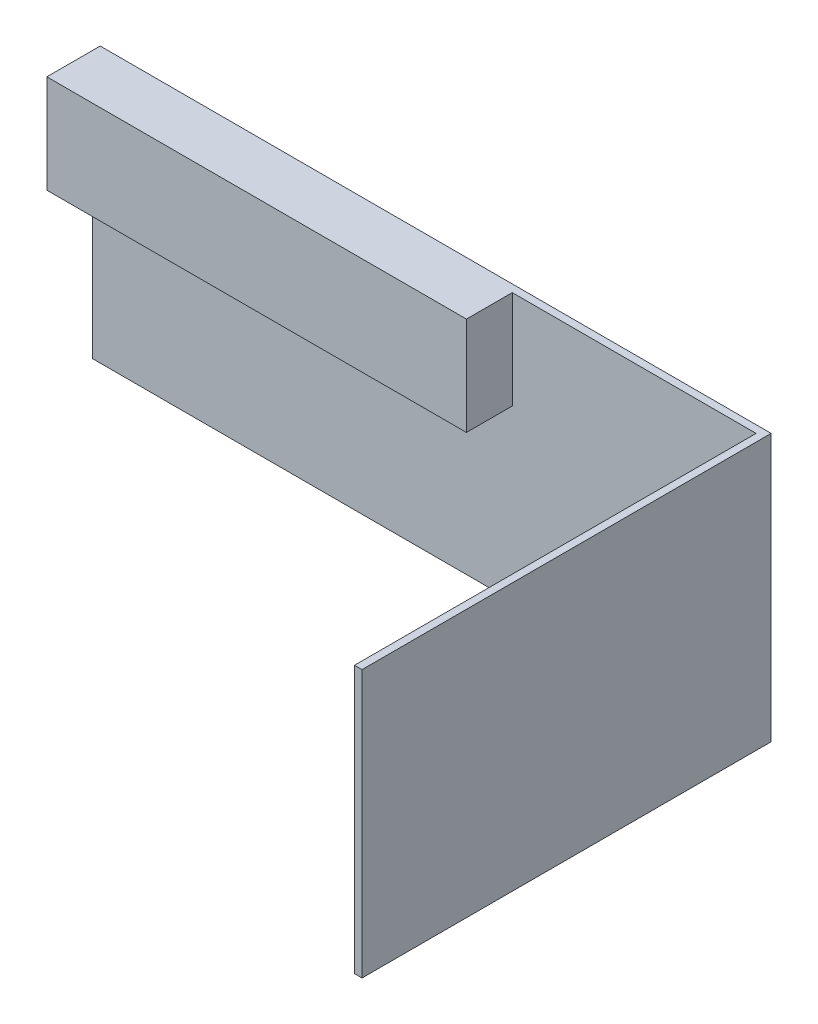
ISO-10303-21;
HEADER;
FILE_DESCRIPTION(('STEP AP214'),'2;1');
FILE_NAME('part.step','',(''),(''),'','','');
FILE_SCHEMA(('AUTOMOTIVE_DESIGN { 1 0 10303 214 1 1 1 1 }'));
ENDSEC;
DATA;
#1=APPLICATION_CONTEXT('core data for automotive mechanical design processes');
#2=APPLICATION_PROTOCOL_DEFINITION('international standard','automotive_design',2000,#1);
#3=PRODUCT_CONTEXT('',#1,'mechanical');
#4=PRODUCT('Part','Part','',(#3));
#5=PRODUCT_RELATED_PRODUCT_CATEGORY('part','',(#4));
#6=PRODUCT_DEFINITION_FORMATION('','',#4);
#7=PRODUCT_DEFINITION_CONTEXT('part definition',#1,'design');
#8=PRODUCT_DEFINITION('design','',#6,#7);
#9=PRODUCT_DEFINITION_SHAPE('','',#8);
#10=(LENGTH_UNIT() NAMED_UNIT(*) SI_UNIT(.MILLI.,.METRE.));
#11=(NAMED_UNIT(*) PLANE_ANGLE_UNIT() SI_UNIT($,.RADIAN.));
#12=(NAMED_UNIT(*) SI_UNIT($,.STERADIAN.) SOLID_ANGLE_UNIT());
#13=UNCERTAINTY_MEASURE_WITH_UNIT(LENGTH_MEASURE(1.E-05),#10,'distance_accuracy_value','');
#14=(GEOMETRIC_REPRESENTATION_CONTEXT(3) GLOBAL_UNCERTAINTY_ASSIGNED_CONTEXT((#13)) GLOBAL_UNIT_ASSIGNED_CONTEXT((#10,
#11,#12)) REPRESENTATION_CONTEXT('',''));
#15=CARTESIAN_POINT('',(0.,0.,0.));
#16=DIRECTION('',(0.,0.,1.));
#17=DIRECTION('',(1.,0.,0.));
#18=AXIS2_PLACEMENT_3D('',#15,#16,#17);
#19=CARTESIAN_POINT('',(0.,0.,0.23));
#20=DIRECTION('',(0.,0.,1.));
#21=DIRECTION('',(1.,0.,0.));
#22=AXIS2_PLACEMENT_3D('',#19,#20,#21);
#23=PLANE('',#22);
#24=DIRECTION('',(1.,0.,0.));
#25=VECTOR('',#24,1.);
#26=CARTESIAN_POINT('',(-21.7772173913043,-2.60765217391304,0.23));
#27=LINE('',#26,#25);
#28=CARTESIAN_POINT('',(-21.7772173913043,-2.60765217391304,0.23));
#29=VERTEX_POINT('',#28);
#30=CARTESIAN_POINT('',(-1.50721739130434,-2.60765217391304,0.23));
#31=VERTEX_POINT('',#30);
#32=EDGE_CURVE('E55',#29,#31,#27,.T.);
#33=ORIENTED_EDGE('',*,*,#32,.T.);
#34=DIRECTION('',(0.,-1.,0.));
#35=VECTOR('',#34,1.);
#36=CARTESIAN_POINT('',(-1.50721739130434,5.55234782608696,0.23));
#37=LINE('',#36,#35);
#38=CARTESIAN_POINT('',(-1.50721739130434,5.55234782608696,0.23));
#39=VERTEX_POINT('',#38);
#40=EDGE_CURVE('E131',#39,#31,#37,.T.);
#41=ORIENTED_EDGE('',*,*,#40,.F.);
#42=DIRECTION('',(-1.,0.,0.));
#43=VECTOR('',#42,1.);
#44=CARTESIAN_POINT('',(-21.7772173913043,5.55234782608696,0.23));
#45=LINE('',#44,#43);
#46=CARTESIAN_POINT('',(-8.95721739130435,5.55234782608696,0.23));
#47=VERTEX_POINT('',#46);
#48=EDGE_CURVE('E61',#39,#47,#45,.T.);
#49=ORIENTED_EDGE('',*,*,#48,.T.);
#50=DIRECTION('',(0.,1.,0.));
#51=VECTOR('',#50,1.);
#52=CARTESIAN_POINT('',(-8.95721739130435,5.55234782608696,0.23));
#53=LINE('',#52,#51);
#54=CARTESIAN_POINT('',(-8.95721739130435,2.55234782608696,0.23));
#55=VERTEX_POINT('',#54);
#56=EDGE_CURVE('E141',#55,#47,#53,.T.);
#57=ORIENTED_EDGE('',*,*,#56,.F.);
#58=DIRECTION('',(1.,0.,0.));
#59=VECTOR('',#58,1.);
#60=CARTESIAN_POINT('',(-21.7772173913043,2.55234782608696,0.23));
#61=LINE('',#60,#59);
#62=CARTESIAN_POINT('',(-21.7772173913043,2.55234782608696,0.23));
#63=VERTEX_POINT('',#62);
#64=EDGE_CURVE('E135',#63,#55,#61,.T.);
#65=ORIENTED_EDGE('',*,*,#64,.F.);
#66=DIRECTION('',(0.,-1.,0.));
#67=VECTOR('',#66,1.);
#68=CARTESIAN_POINT('',(-21.7772173913043,5.55234782608696,0.23));
#69=LINE('',#68,#67);
#70=EDGE_CURVE('E175',#63,#29,#69,.T.);
#71=ORIENTED_EDGE('',*,*,#70,.T.);
#72=EDGE_LOOP('',(#33,#41,#49,#57,#65,#71));
#73=FACE_BOUND('',#72,.T.);
#74=ADVANCED_FACE('F39',(#73),#23,.T.);
#75=CARTESIAN_POINT('',(-21.7772173913043,5.55234782608696,0.23));
#76=DIRECTION('',(1.,0.,0.));
#77=DIRECTION('',(0.,0.,-1.));
#78=AXIS2_PLACEMENT_3D('',#75,#76,#77);
#79=PLANE('',#78);
#80=DIRECTION('',(0.,-1.,0.));
#81=VECTOR('',#80,1.);
#82=CARTESIAN_POINT('',(-21.7772173913043,5.55234782608696,0.));
#83=LINE('',#82,#81);
#84=CARTESIAN_POINT('',(-21.7772173913043,5.55234782608696,0.));
#85=VERTEX_POINT('',#84);
#86=CARTESIAN_POINT('',(-21.7772173913043,-2.60765217391304,0.));
#87=VERTEX_POINT('',#86);
#88=EDGE_CURVE('E174',#85,#87,#83,.T.);
#89=ORIENTED_EDGE('',*,*,#88,.T.);
#90=DIRECTION('',(0.,0.,-1.));
#91=VECTOR('',#90,1.);
#92=CARTESIAN_POINT('',(-21.7772173913043,-2.60765217391304,0.23));
#93=LINE('',#92,#91);
#94=EDGE_CURVE('E11',#29,#87,#93,.T.);
#95=ORIENTED_EDGE('',*,*,#94,.F.);
#96=ORIENTED_EDGE('',*,*,#70,.F.);
#97=DIRECTION('',(0.,0.,-1.));
#98=VECTOR('',#97,1.);
#99=CARTESIAN_POINT('',(-21.7772173913043,2.55234782608696,1.63));
#100=LINE('',#99,#98);
#101=CARTESIAN_POINT('',(-21.7772173913043,2.55234782608696,1.63));
#102=VERTEX_POINT('',#101);
#103=EDGE_CURVE('E170',#102,#63,#100,.T.);
#104=ORIENTED_EDGE('',*,*,#103,.F.);
#105=DIRECTION('',(0.,-1.,0.));
#106=VECTOR('',#105,1.);
#107=CARTESIAN_POINT('',(-21.7772173913043,5.55234782608696,1.63));
#108=LINE('',#107,#106);
#109=CARTESIAN_POINT('',(-21.7772173913043,5.55234782608696,1.63));
#110=VERTEX_POINT('',#109);
#111=EDGE_CURVE('E146',#110,#102,#108,.T.);
#112=ORIENTED_EDGE('',*,*,#111,.F.);
#113=DIRECTION('',(0.,0.,-1.));
#114=VECTOR('',#113,1.);
#115=CARTESIAN_POINT('',(-21.7772173913043,5.55234782608696,0.23));
#116=LINE('',#115,#114);
#117=EDGE_CURVE('E183',#110,#85,#116,.T.);
#118=ORIENTED_EDGE('',*,*,#117,.T.);
#119=EDGE_LOOP('',(#89,#95,#96,#104,#112,#118));
#120=FACE_BOUND('',#119,.T.);
#121=ADVANCED_FACE('F41',(#120),#79,.F.);
#122=CARTESIAN_POINT('',(-21.7772173913043,-2.60765217391304,0.23));
#123=DIRECTION('',(0.,1.,0.));
#124=DIRECTION('',(-1.,0.,0.));
#125=AXIS2_PLACEMENT_3D('',#122,#123,#124);
#126=PLANE('',#125);
#127=DIRECTION('',(1.,0.,0.));
#128=VECTOR('',#127,1.);
#129=CARTESIAN_POINT('',(-21.7772173913043,-2.60765217391304,0.));
#130=LINE('',#129,#128);
#131=CARTESIAN_POINT('',(-1.27721739130434,-2.60765217391304,0.));
#132=VERTEX_POINT('',#131);
#133=EDGE_CURVE('E187',#87,#132,#130,.T.);
#134=ORIENTED_EDGE('',*,*,#133,.T.);
#135=DIRECTION('',(0.,0.,-1.));
#136=VECTOR('',#135,1.);
#137=CARTESIAN_POINT('',(-1.27721739130434,-2.60765217391304,0.23));
#138=LINE('',#137,#136);
#139=CARTESIAN_POINT('',(-1.27721739130434,-2.60765217391304,12.5));
#140=VERTEX_POINT('',#139);
#141=EDGE_CURVE('E48',#140,#132,#138,.T.);
#142=ORIENTED_EDGE('',*,*,#141,.F.);
#143=DIRECTION('',(1.,0.,0.));
#144=VECTOR('',#143,1.);
#145=CARTESIAN_POINT('',(-1.50721739130434,-2.60765217391304,12.5));
#146=LINE('',#145,#144);
#147=CARTESIAN_POINT('',(-1.50721739130434,-2.60765217391304,12.5));
#148=VERTEX_POINT('',#147);
#149=EDGE_CURVE('E109',#148,#140,#146,.T.);
#150=ORIENTED_EDGE('',*,*,#149,.F.);
#151=DIRECTION('',(0.,0.,-1.));
#152=VECTOR('',#151,1.);
#153=CARTESIAN_POINT('',(-1.50721739130434,-2.60765217391304,12.5));
#154=LINE('',#153,#152);
#155=EDGE_CURVE('E113',#148,#31,#154,.T.);
#156=ORIENTED_EDGE('',*,*,#155,.T.);
#157=ORIENTED_EDGE('',*,*,#32,.F.);
#158=ORIENTED_EDGE('',*,*,#94,.T.);
#159=EDGE_LOOP('',(#134,#142,#150,#156,#157,#158));
#160=FACE_BOUND('',#159,.T.);
#161=ADVANCED_FACE('F111',(#160),#126,.F.);
#162=CARTESIAN_POINT('',(-1.27721739130434,5.55234782608696,0.23));
#163=DIRECTION('',(-1.,0.,0.));
#164=DIRECTION('',(0.,0.,1.));
#165=AXIS2_PLACEMENT_3D('',#162,#163,#164);
#166=PLANE('',#165);
#167=DIRECTION('',(0.,1.,0.));
#168=VECTOR('',#167,1.);
#169=CARTESIAN_POINT('',(-1.27721739130434,5.55234782608696,0.));
#170=LINE('',#169,#168);
#171=CARTESIAN_POINT('',(-1.27721739130434,5.55234782608696,0.));
#172=VERTEX_POINT('',#171);
#173=EDGE_CURVE('E190',#132,#172,#170,.T.);
#174=ORIENTED_EDGE('',*,*,#173,.T.);
#175=DIRECTION('',(0.,0.,-1.));
#176=VECTOR('',#175,1.);
#177=CARTESIAN_POINT('',(-1.27721739130434,5.55234782608696,0.23));
#178=LINE('',#177,#176);
#179=CARTESIAN_POINT('',(-1.27721739130434,5.55234782608696,12.5));
#180=VERTEX_POINT('',#179);
#181=EDGE_CURVE('E198',#180,#172,#178,.T.);
#182=ORIENTED_EDGE('',*,*,#181,.F.);
#183=DIRECTION('',(0.,1.,0.));
#184=VECTOR('',#183,1.);
#185=CARTESIAN_POINT('',(-1.27721739130434,5.55234782608696,12.5));
#186=LINE('',#185,#184);
#187=EDGE_CURVE('E120',#140,#180,#186,.T.);
#188=ORIENTED_EDGE('',*,*,#187,.F.);
#189=ORIENTED_EDGE('',*,*,#141,.T.);
#190=EDGE_LOOP('',(#174,#182,#188,#189));
#191=FACE_BOUND('',#190,.T.);
#192=ADVANCED_FACE('F204',(#191),#166,.F.);
#193=CARTESIAN_POINT('',(-21.7772173913043,5.55234782608696,0.23));
#194=DIRECTION('',(0.,-1.,0.));
#195=DIRECTION('',(0.,0.,-1.));
#196=AXIS2_PLACEMENT_3D('',#193,#194,#195);
#197=PLANE('',#196);
#198=DIRECTION('',(-1.,0.,0.));
#199=VECTOR('',#198,1.);
#200=CARTESIAN_POINT('',(-21.7772173913043,5.55234782608696,0.));
#201=LINE('',#200,#199);
#202=EDGE_CURVE('E178',#172,#85,#201,.T.);
#203=ORIENTED_EDGE('',*,*,#202,.T.);
#204=ORIENTED_EDGE('',*,*,#117,.F.);
#205=DIRECTION('',(-1.,0.,0.));
#206=VECTOR('',#205,1.);
#207=CARTESIAN_POINT('',(-21.7772173913043,5.55234782608696,1.63));
#208=LINE('',#207,#206);
#209=CARTESIAN_POINT('',(-8.95721739130435,5.55234782608696,1.63));
#210=VERTEX_POINT('',#209);
#211=EDGE_CURVE('E156',#210,#110,#208,.T.);
#212=ORIENTED_EDGE('',*,*,#211,.F.);
#213=DIRECTION('',(0.,0.,-1.));
#214=VECTOR('',#213,1.);
#215=CARTESIAN_POINT('',(-8.95721739130435,5.55234782608696,1.63));
#216=LINE('',#215,#214);
#217=EDGE_CURVE('E159',#210,#47,#216,.T.);
#218=ORIENTED_EDGE('',*,*,#217,.T.);
#219=ORIENTED_EDGE('',*,*,#48,.F.);
#220=DIRECTION('',(0.,0.,-1.));
#221=VECTOR('',#220,1.);
#222=CARTESIAN_POINT('',(-1.50721739130434,5.55234782608696,12.5));
#223=LINE('',#222,#221);
#224=CARTESIAN_POINT('',(-1.50721739130434,5.55234782608696,12.5));
#225=VERTEX_POINT('',#224);
#226=EDGE_CURVE('E136',#225,#39,#223,.T.);
#227=ORIENTED_EDGE('',*,*,#226,.F.);
#228=DIRECTION('',(-1.,0.,0.));
#229=VECTOR('',#228,1.);
#230=CARTESIAN_POINT('',(-1.50721739130434,5.55234782608696,12.5));
#231=LINE('',#230,#229);
#232=EDGE_CURVE('E126',#180,#225,#231,.T.);
#233=ORIENTED_EDGE('',*,*,#232,.F.);
#234=ORIENTED_EDGE('',*,*,#181,.T.);
#235=EDGE_LOOP('',(#203,#204,#212,#218,#219,#227,#233,#234));
#236=FACE_BOUND('',#235,.T.);
#237=ADVANCED_FACE('F210',(#236),#197,.F.);
#238=CARTESIAN_POINT('',(0.,0.,0.));
#239=DIRECTION('',(0.,0.,1.));
#240=DIRECTION('',(1.,0.,0.));
#241=AXIS2_PLACEMENT_3D('',#238,#239,#240);
#242=PLANE('',#241);
#243=ORIENTED_EDGE('',*,*,#88,.F.);
#244=ORIENTED_EDGE('',*,*,#202,.F.);
#245=ORIENTED_EDGE('',*,*,#173,.F.);
#246=ORIENTED_EDGE('',*,*,#133,.F.);
#247=EDGE_LOOP('',(#243,#244,#245,#246));
#248=FACE_BOUND('',#247,.T.);
#249=ADVANCED_FACE('F208',(#248),#242,.F.);
#250=CARTESIAN_POINT('',(-21.7772173913043,2.55234782608696,1.63));
#251=DIRECTION('',(0.,1.,0.));
#252=DIRECTION('',(0.,0.,1.));
#253=AXIS2_PLACEMENT_3D('',#250,#251,#252);
#254=PLANE('',#253);
#255=ORIENTED_EDGE('',*,*,#64,.T.);
#256=DIRECTION('',(0.,0.,-1.));
#257=VECTOR('',#256,1.);
#258=CARTESIAN_POINT('',(-8.95721739130435,2.55234782608696,1.63));
#259=LINE('',#258,#257);
#260=CARTESIAN_POINT('',(-8.95721739130435,2.55234782608696,1.63));
#261=VERTEX_POINT('',#260);
#262=EDGE_CURVE('E166',#261,#55,#259,.T.);
#263=ORIENTED_EDGE('',*,*,#262,.F.);
#264=DIRECTION('',(1.,0.,0.));
#265=VECTOR('',#264,1.);
#266=CARTESIAN_POINT('',(-21.7772173913043,2.55234782608696,1.63));
#267=LINE('',#266,#265);
#268=EDGE_CURVE('E150',#102,#261,#267,.T.);
#269=ORIENTED_EDGE('',*,*,#268,.F.);
#270=ORIENTED_EDGE('',*,*,#103,.T.);
#271=EDGE_LOOP('',(#255,#263,#269,#270));
#272=FACE_BOUND('',#271,.T.);
#273=ADVANCED_FACE('F225',(#272),#254,.F.);
#274=CARTESIAN_POINT('',(-8.95721739130435,5.55234782608696,1.63));
#275=DIRECTION('',(-1.,0.,0.));
#276=DIRECTION('',(0.,0.,1.));
#277=AXIS2_PLACEMENT_3D('',#274,#275,#276);
#278=PLANE('',#277);
#279=ORIENTED_EDGE('',*,*,#56,.T.);
#280=ORIENTED_EDGE('',*,*,#217,.F.);
#281=DIRECTION('',(0.,1.,0.));
#282=VECTOR('',#281,1.);
#283=CARTESIAN_POINT('',(-8.95721739130435,5.55234782608696,1.63));
#284=LINE('',#283,#282);
#285=EDGE_CURVE('E153',#261,#210,#284,.T.);
#286=ORIENTED_EDGE('',*,*,#285,.F.);
#287=ORIENTED_EDGE('',*,*,#262,.T.);
#288=EDGE_LOOP('',(#279,#280,#286,#287));
#289=FACE_BOUND('',#288,.T.);
#290=ADVANCED_FACE('F223',(#289),#278,.F.);
#291=CARTESIAN_POINT('',(0.,0.,1.63));
#292=DIRECTION('',(0.,0.,1.));
#293=DIRECTION('',(1.,0.,0.));
#294=AXIS2_PLACEMENT_3D('',#291,#292,#293);
#295=PLANE('',#294);
#296=ORIENTED_EDGE('',*,*,#111,.T.);
#297=ORIENTED_EDGE('',*,*,#268,.T.);
#298=ORIENTED_EDGE('',*,*,#285,.T.);
#299=ORIENTED_EDGE('',*,*,#211,.T.);
#300=EDGE_LOOP('',(#296,#297,#298,#299));
#301=FACE_BOUND('',#300,.T.);
#302=ADVANCED_FACE('F218',(#301),#295,.T.);
#303=CARTESIAN_POINT('',(-1.50721739130434,5.55234782608696,12.5));
#304=DIRECTION('',(1.,0.,0.));
#305=DIRECTION('',(0.,1.,0.));
#306=AXIS2_PLACEMENT_3D('',#303,#304,#305);
#307=PLANE('',#306);
#308=ORIENTED_EDGE('',*,*,#40,.T.);
#309=ORIENTED_EDGE('',*,*,#155,.F.);
#310=DIRECTION('',(0.,-1.,0.));
#311=VECTOR('',#310,1.);
#312=CARTESIAN_POINT('',(-1.50721739130434,5.55234782608696,12.5));
#313=LINE('',#312,#311);
#314=EDGE_CURVE('E121',#225,#148,#313,.T.);
#315=ORIENTED_EDGE('',*,*,#314,.F.);
#316=ORIENTED_EDGE('',*,*,#226,.T.);
#317=EDGE_LOOP('',(#308,#309,#315,#316));
#318=FACE_BOUND('',#317,.T.);
#319=ADVANCED_FACE('F133',(#318),#307,.F.);
#320=CARTESIAN_POINT('',(0.,0.,12.5));
#321=DIRECTION('',(0.,0.,1.));
#322=DIRECTION('',(1.,0.,0.));
#323=AXIS2_PLACEMENT_3D('',#320,#321,#322);
#324=PLANE('',#323);
#325=ORIENTED_EDGE('',*,*,#314,.T.);
#326=ORIENTED_EDGE('',*,*,#149,.T.);
#327=ORIENTED_EDGE('',*,*,#187,.T.);
#328=ORIENTED_EDGE('',*,*,#232,.T.);
#329=EDGE_LOOP('',(#325,#326,#327,#328));
#330=FACE_BOUND('',#329,.T.);
#331=ADVANCED_FACE('F124',(#330),#324,.T.);
#332=CLOSED_SHELL('',(#74,#121,#161,#192,#237,#249,#273,#290,#302,#319,#331));
#333=MANIFOLD_SOLID_BREP('B2',#332);
#334=ADVANCED_BREP_SHAPE_REPRESENTATION('',(#18,#333),#14);
#335=SHAPE_DEFINITION_REPRESENTATION(#9,#334);
ENDSEC;
END-ISO-10303-21;
